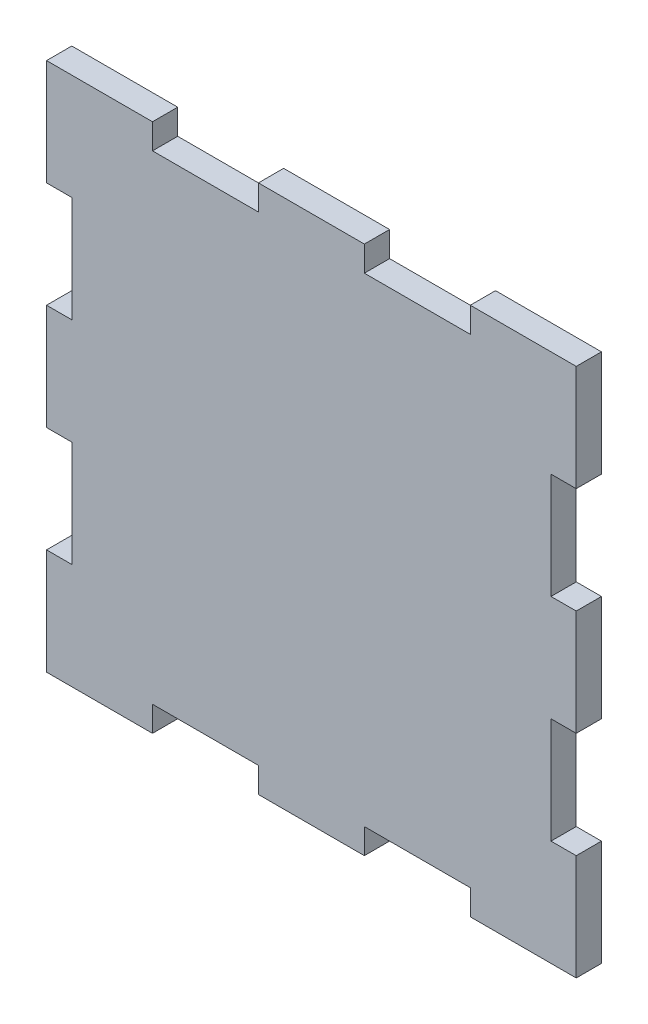
ISO-10303-21;
HEADER;
FILE_DESCRIPTION(('STEP AP214'),'2;1');
FILE_NAME('part.step','',(''),(''),'','','');
FILE_SCHEMA(('AUTOMOTIVE_DESIGN { 1 0 10303 214 1 1 1 1 }'));
ENDSEC;
DATA;
#1=APPLICATION_CONTEXT('core data for automotive mechanical design processes');
#2=APPLICATION_PROTOCOL_DEFINITION('international standard','automotive_design',2000,#1);
#3=PRODUCT_CONTEXT('',#1,'mechanical');
#4=PRODUCT('Part','Part','',(#3));
#5=PRODUCT_RELATED_PRODUCT_CATEGORY('part','',(#4));
#6=PRODUCT_DEFINITION_FORMATION('','',#4);
#7=PRODUCT_DEFINITION_CONTEXT('part definition',#1,'design');
#8=PRODUCT_DEFINITION('design','',#6,#7);
#9=PRODUCT_DEFINITION_SHAPE('','',#8);
#10=(LENGTH_UNIT() NAMED_UNIT(*) SI_UNIT(.MILLI.,.METRE.));
#11=(NAMED_UNIT(*) PLANE_ANGLE_UNIT() SI_UNIT($,.RADIAN.));
#12=(NAMED_UNIT(*) SI_UNIT($,.STERADIAN.) SOLID_ANGLE_UNIT());
#13=UNCERTAINTY_MEASURE_WITH_UNIT(LENGTH_MEASURE(1.E-05),#10,'distance_accuracy_value','');
#14=(GEOMETRIC_REPRESENTATION_CONTEXT(3) GLOBAL_UNCERTAINTY_ASSIGNED_CONTEXT((#13)) GLOBAL_UNIT_ASSIGNED_CONTEXT((#10,
#11,#12)) REPRESENTATION_CONTEXT('',''));
#15=CARTESIAN_POINT('',(0.,0.,0.));
#16=DIRECTION('',(0.,0.,1.));
#17=DIRECTION('',(1.,0.,0.));
#18=AXIS2_PLACEMENT_3D('',#15,#16,#17);
#19=CARTESIAN_POINT('',(50.,100.,4.7625));
#20=DIRECTION('',(0.,-1.,0.));
#21=DIRECTION('',(1.,0.,0.));
#22=AXIS2_PLACEMENT_3D('',#19,#20,#21);
#23=PLANE('',#22);
#24=DIRECTION('',(-1.,0.,0.));
#25=VECTOR('',#24,1.);
#26=CARTESIAN_POINT('',(50.,100.,0.));
#27=LINE('',#26,#25);
#28=CARTESIAN_POINT('',(50.,100.,0.));
#29=VERTEX_POINT('',#28);
#30=CARTESIAN_POINT('',(30.,100.,0.));
#31=VERTEX_POINT('',#30);
#32=EDGE_CURVE('E368',#29,#31,#27,.T.);
#33=ORIENTED_EDGE('',*,*,#32,.T.);
#34=DIRECTION('',(0.,0.,-1.));
#35=VECTOR('',#34,1.);
#36=CARTESIAN_POINT('',(30.,100.,-90.475));
#37=LINE('',#36,#35);
#38=CARTESIAN_POINT('',(30.,100.,4.7625));
#39=VERTEX_POINT('',#38);
#40=EDGE_CURVE('E279',#39,#31,#37,.T.);
#41=ORIENTED_EDGE('',*,*,#40,.F.);
#42=DIRECTION('',(-1.,0.,0.));
#43=VECTOR('',#42,1.);
#44=CARTESIAN_POINT('',(50.,100.,4.7625));
#45=LINE('',#44,#43);
#46=CARTESIAN_POINT('',(50.,100.,4.7625));
#47=VERTEX_POINT('',#46);
#48=EDGE_CURVE('E307',#47,#39,#45,.T.);
#49=ORIENTED_EDGE('',*,*,#48,.F.);
#50=DIRECTION('',(0.,0.,-1.));
#51=VECTOR('',#50,1.);
#52=CARTESIAN_POINT('',(50.,100.,4.7625));
#53=LINE('',#52,#51);
#54=EDGE_CURVE('E478',#47,#29,#53,.T.);
#55=ORIENTED_EDGE('',*,*,#54,.T.);
#56=EDGE_LOOP('',(#33,#41,#49,#55));
#57=FACE_BOUND('',#56,.T.);
#58=ADVANCED_FACE('F33',(#57),#23,.F.);
#59=CARTESIAN_POINT('',(10.,100.,4.7625));
#60=VERTEX_POINT('',#59);
#61=CARTESIAN_POINT('',(-9.99999999999998,100.,4.7625));
#62=VERTEX_POINT('',#61);
#63=EDGE_CURVE('E311',#60,#62,#45,.T.);
#64=ORIENTED_EDGE('',*,*,#63,.F.);
#65=DIRECTION('',(0.,0.,1.));
#66=VECTOR('',#65,1.);
#67=CARTESIAN_POINT('',(10.,100.,-90.475));
#68=LINE('',#67,#66);
#69=CARTESIAN_POINT('',(10.,100.,0.));
#70=VERTEX_POINT('',#69);
#71=EDGE_CURVE('E634',#70,#60,#68,.T.);
#72=ORIENTED_EDGE('',*,*,#71,.F.);
#73=CARTESIAN_POINT('',(-9.99999999999998,100.,0.));
#74=VERTEX_POINT('',#73);
#75=EDGE_CURVE('E372',#70,#74,#27,.T.);
#76=ORIENTED_EDGE('',*,*,#75,.T.);
#77=DIRECTION('',(0.,0.,-1.));
#78=VECTOR('',#77,1.);
#79=CARTESIAN_POINT('',(-9.99999999999998,100.,-90.475));
#80=LINE('',#79,#78);
#81=EDGE_CURVE('E632',#62,#74,#80,.T.);
#82=ORIENTED_EDGE('',*,*,#81,.F.);
#83=EDGE_LOOP('',(#64,#72,#76,#82));
#84=FACE_BOUND('',#83,.T.);
#85=ADVANCED_FACE('F631',(#84),#23,.F.);
#86=CARTESIAN_POINT('',(45.2375,40.,4.7625));
#87=DIRECTION('',(0.,1.,0.));
#88=DIRECTION('',(0.,0.,1.));
#89=AXIS2_PLACEMENT_3D('',#86,#87,#88);
#90=PLANE('',#89);
#91=DIRECTION('',(1.,0.,0.));
#92=VECTOR('',#91,1.);
#93=CARTESIAN_POINT('',(45.2375,40.,0.));
#94=LINE('',#93,#92);
#95=CARTESIAN_POINT('',(45.2375,40.,0.));
#96=VERTEX_POINT('',#95);
#97=CARTESIAN_POINT('',(50.,40.,0.));
#98=VERTEX_POINT('',#97);
#99=EDGE_CURVE('E354',#96,#98,#94,.T.);
#100=ORIENTED_EDGE('',*,*,#99,.T.);
#101=DIRECTION('',(0.,0.,-1.));
#102=VECTOR('',#101,1.);
#103=CARTESIAN_POINT('',(50.,40.,4.7625));
#104=LINE('',#103,#102);
#105=CARTESIAN_POINT('',(50.,40.,4.7625));
#106=VERTEX_POINT('',#105);
#107=EDGE_CURVE('E271',#106,#98,#104,.T.);
#108=ORIENTED_EDGE('',*,*,#107,.F.);
#109=DIRECTION('',(1.,0.,0.));
#110=VECTOR('',#109,1.);
#111=CARTESIAN_POINT('',(45.2375,40.,4.7625));
#112=LINE('',#111,#110);
#113=CARTESIAN_POINT('',(45.2375,40.,4.7625));
#114=VERTEX_POINT('',#113);
#115=EDGE_CURVE('E292',#114,#106,#112,.T.);
#116=ORIENTED_EDGE('',*,*,#115,.F.);
#117=DIRECTION('',(0.,0.,-1.));
#118=VECTOR('',#117,1.);
#119=CARTESIAN_POINT('',(45.2375,40.,4.7625));
#120=LINE('',#119,#118);
#121=EDGE_CURVE('E353',#114,#96,#120,.T.);
#122=ORIENTED_EDGE('',*,*,#121,.T.);
#123=EDGE_LOOP('',(#100,#108,#116,#122));
#124=FACE_BOUND('',#123,.T.);
#125=ADVANCED_FACE('F35',(#124),#90,.F.);
#126=CARTESIAN_POINT('',(50.,40.,4.7625));
#127=DIRECTION('',(-1.,0.,0.));
#128=DIRECTION('',(0.,-1.,0.));
#129=AXIS2_PLACEMENT_3D('',#126,#127,#128);
#130=PLANE('',#129);
#131=DIRECTION('',(0.,1.,0.));
#132=VECTOR('',#131,1.);
#133=CARTESIAN_POINT('',(50.,40.,0.));
#134=LINE('',#133,#132);
#135=CARTESIAN_POINT('',(50.0000000000002,60.,0.));
#136=VERTEX_POINT('',#135);
#137=EDGE_CURVE('E357',#98,#136,#134,.T.);
#138=ORIENTED_EDGE('',*,*,#137,.T.);
#139=DIRECTION('',(0.,0.,-1.));
#140=VECTOR('',#139,1.);
#141=CARTESIAN_POINT('',(50.0000000000002,60.,4.7625));
#142=LINE('',#141,#140);
#143=CARTESIAN_POINT('',(50.0000000000002,60.,4.7625));
#144=VERTEX_POINT('',#143);
#145=EDGE_CURVE('E490',#144,#136,#142,.T.);
#146=ORIENTED_EDGE('',*,*,#145,.F.);
#147=DIRECTION('',(0.,1.,0.));
#148=VECTOR('',#147,1.);
#149=CARTESIAN_POINT('',(50.,40.,4.7625));
#150=LINE('',#149,#148);
#151=EDGE_CURVE('E295',#106,#144,#150,.T.);
#152=ORIENTED_EDGE('',*,*,#151,.F.);
#153=ORIENTED_EDGE('',*,*,#107,.T.);
#154=EDGE_LOOP('',(#138,#146,#152,#153));
#155=FACE_BOUND('',#154,.T.);
#156=ADVANCED_FACE('F495',(#155),#130,.F.);
#157=CARTESIAN_POINT('',(50.0000000000002,60.,4.7625));
#158=DIRECTION('',(0.,-1.,0.));
#159=DIRECTION('',(0.,0.,-1.));
#160=AXIS2_PLACEMENT_3D('',#157,#158,#159);
#161=PLANE('',#160);
#162=DIRECTION('',(-1.,0.,0.));
#163=VECTOR('',#162,1.);
#164=CARTESIAN_POINT('',(50.0000000000002,60.,0.));
#165=LINE('',#164,#163);
#166=CARTESIAN_POINT('',(45.2375000000002,60.,0.));
#167=VERTEX_POINT('',#166);
#168=EDGE_CURVE('E360',#136,#167,#165,.T.);
#169=ORIENTED_EDGE('',*,*,#168,.T.);
#170=DIRECTION('',(0.,0.,-1.));
#171=VECTOR('',#170,1.);
#172=CARTESIAN_POINT('',(45.2375000000002,60.,4.7625));
#173=LINE('',#172,#171);
#174=CARTESIAN_POINT('',(45.2375000000002,60.,4.7625));
#175=VERTEX_POINT('',#174);
#176=EDGE_CURVE('E487',#175,#167,#173,.T.);
#177=ORIENTED_EDGE('',*,*,#176,.F.);
#178=DIRECTION('',(-1.,0.,0.));
#179=VECTOR('',#178,1.);
#180=CARTESIAN_POINT('',(50.0000000000002,60.,4.7625));
#181=LINE('',#180,#179);
#182=EDGE_CURVE('E298',#144,#175,#181,.T.);
#183=ORIENTED_EDGE('',*,*,#182,.F.);
#184=ORIENTED_EDGE('',*,*,#145,.T.);
#185=EDGE_LOOP('',(#169,#177,#183,#184));
#186=FACE_BOUND('',#185,.T.);
#187=ADVANCED_FACE('F508',(#186),#161,.F.);
#188=CARTESIAN_POINT('',(45.2375000000002,60.,4.7625));
#189=DIRECTION('',(-1.,0.,0.));
#190=DIRECTION('',(0.,0.,1.));
#191=AXIS2_PLACEMENT_3D('',#188,#189,#190);
#192=PLANE('',#191);
#193=DIRECTION('',(0.,1.,0.));
#194=VECTOR('',#193,1.);
#195=CARTESIAN_POINT('',(45.2375000000002,60.,0.));
#196=LINE('',#195,#194);
#197=CARTESIAN_POINT('',(45.2375000000002,80.,0.));
#198=VERTEX_POINT('',#197);
#199=EDGE_CURVE('E362',#167,#198,#196,.T.);
#200=ORIENTED_EDGE('',*,*,#199,.T.);
#201=DIRECTION('',(0.,0.,-1.));
#202=VECTOR('',#201,1.);
#203=CARTESIAN_POINT('',(45.2375000000002,80.,4.7625));
#204=LINE('',#203,#202);
#205=CARTESIAN_POINT('',(45.2375000000002,80.,4.7625));
#206=VERTEX_POINT('',#205);
#207=EDGE_CURVE('E484',#206,#198,#204,.T.);
#208=ORIENTED_EDGE('',*,*,#207,.F.);
#209=DIRECTION('',(0.,1.,0.));
#210=VECTOR('',#209,1.);
#211=CARTESIAN_POINT('',(45.2375000000002,60.,4.7625));
#212=LINE('',#211,#210);
#213=EDGE_CURVE('E300',#175,#206,#212,.T.);
#214=ORIENTED_EDGE('',*,*,#213,.F.);
#215=ORIENTED_EDGE('',*,*,#176,.T.);
#216=EDGE_LOOP('',(#200,#208,#214,#215));
#217=FACE_BOUND('',#216,.T.);
#218=ADVANCED_FACE('F512',(#217),#192,.F.);
#219=CARTESIAN_POINT('',(45.2375000000002,80.,4.7625));
#220=DIRECTION('',(0.,1.,0.));
#221=DIRECTION('',(0.,0.,1.));
#222=AXIS2_PLACEMENT_3D('',#219,#220,#221);
#223=PLANE('',#222);
#224=DIRECTION('',(1.,0.,0.));
#225=VECTOR('',#224,1.);
#226=CARTESIAN_POINT('',(45.2375000000002,80.,0.));
#227=LINE('',#226,#225);
#228=CARTESIAN_POINT('',(50.0000000000002,80.,0.));
#229=VERTEX_POINT('',#228);
#230=EDGE_CURVE('E364',#198,#229,#227,.T.);
#231=ORIENTED_EDGE('',*,*,#230,.T.);
#232=DIRECTION('',(0.,0.,-1.));
#233=VECTOR('',#232,1.);
#234=CARTESIAN_POINT('',(50.0000000000002,80.,4.7625));
#235=LINE('',#234,#233);
#236=CARTESIAN_POINT('',(50.0000000000002,80.,4.7625));
#237=VERTEX_POINT('',#236);
#238=EDGE_CURVE('E481',#237,#229,#235,.T.);
#239=ORIENTED_EDGE('',*,*,#238,.F.);
#240=DIRECTION('',(1.,0.,0.));
#241=VECTOR('',#240,1.);
#242=CARTESIAN_POINT('',(45.2375000000002,80.,4.7625));
#243=LINE('',#242,#241);
#244=EDGE_CURVE('E302',#206,#237,#243,.T.);
#245=ORIENTED_EDGE('',*,*,#244,.F.);
#246=ORIENTED_EDGE('',*,*,#207,.T.);
#247=EDGE_LOOP('',(#231,#239,#245,#246));
#248=FACE_BOUND('',#247,.T.);
#249=ADVANCED_FACE('F687',(#248),#223,.F.);
#250=CARTESIAN_POINT('',(50.0000000000002,80.,4.7625));
#251=DIRECTION('',(-1.,0.,0.));
#252=DIRECTION('',(0.,-1.,0.));
#253=AXIS2_PLACEMENT_3D('',#250,#251,#252);
#254=PLANE('',#253);
#255=DIRECTION('',(0.,1.,0.));
#256=VECTOR('',#255,1.);
#257=CARTESIAN_POINT('',(50.0000000000002,80.,0.));
#258=LINE('',#257,#256);
#259=EDGE_CURVE('E366',#229,#29,#258,.T.);
#260=ORIENTED_EDGE('',*,*,#259,.T.);
#261=ORIENTED_EDGE('',*,*,#54,.F.);
#262=DIRECTION('',(0.,1.,0.));
#263=VECTOR('',#262,1.);
#264=CARTESIAN_POINT('',(50.0000000000002,80.,4.7625));
#265=LINE('',#264,#263);
#266=EDGE_CURVE('E304',#237,#47,#265,.T.);
#267=ORIENTED_EDGE('',*,*,#266,.F.);
#268=ORIENTED_EDGE('',*,*,#238,.T.);
#269=EDGE_LOOP('',(#260,#261,#267,#268));
#270=FACE_BOUND('',#269,.T.);
#271=ADVANCED_FACE('F682',(#270),#254,.F.);
#272=CARTESIAN_POINT('',(-30.,100.,4.7625));
#273=VERTEX_POINT('',#272);
#274=CARTESIAN_POINT('',(-50.,100.,4.7625));
#275=VERTEX_POINT('',#274);
#276=EDGE_CURVE('E306',#273,#275,#45,.T.);
#277=ORIENTED_EDGE('',*,*,#276,.F.);
#278=DIRECTION('',(0.,0.,1.));
#279=VECTOR('',#278,1.);
#280=CARTESIAN_POINT('',(-30.,100.,-90.475));
#281=LINE('',#280,#279);
#282=CARTESIAN_POINT('',(-30.,100.,0.));
#283=VERTEX_POINT('',#282);
#284=EDGE_CURVE('E624',#283,#273,#281,.T.);
#285=ORIENTED_EDGE('',*,*,#284,.F.);
#286=CARTESIAN_POINT('',(-50.,100.,0.));
#287=VERTEX_POINT('',#286);
#288=EDGE_CURVE('E284',#283,#287,#27,.T.);
#289=ORIENTED_EDGE('',*,*,#288,.T.);
#290=DIRECTION('',(0.,0.,-1.));
#291=VECTOR('',#290,1.);
#292=CARTESIAN_POINT('',(-50.,100.,4.7625));
#293=LINE('',#292,#291);
#294=EDGE_CURVE('E475',#275,#287,#293,.T.);
#295=ORIENTED_EDGE('',*,*,#294,.F.);
#296=EDGE_LOOP('',(#277,#285,#289,#295));
#297=FACE_BOUND('',#296,.T.);
#298=ADVANCED_FACE('F623',(#297),#23,.F.);
#299=CARTESIAN_POINT('',(-50.,100.,4.7625));
#300=DIRECTION('',(1.,0.,0.));
#301=DIRECTION('',(0.,1.,0.));
#302=AXIS2_PLACEMENT_3D('',#299,#300,#301);
#303=PLANE('',#302);
#304=DIRECTION('',(0.,-1.,0.));
#305=VECTOR('',#304,1.);
#306=CARTESIAN_POINT('',(-50.,100.,0.));
#307=LINE('',#306,#305);
#308=CARTESIAN_POINT('',(-49.9999999999998,80.,0.));
#309=VERTEX_POINT('',#308);
#310=EDGE_CURVE('E371',#287,#309,#307,.T.);
#311=ORIENTED_EDGE('',*,*,#310,.T.);
#312=DIRECTION('',(0.,0.,-1.));
#313=VECTOR('',#312,1.);
#314=CARTESIAN_POINT('',(-49.9999999999998,80.,4.7625));
#315=LINE('',#314,#313);
#316=CARTESIAN_POINT('',(-49.9999999999998,80.,4.7625));
#317=VERTEX_POINT('',#316);
#318=EDGE_CURVE('E472',#317,#309,#315,.T.);
#319=ORIENTED_EDGE('',*,*,#318,.F.);
#320=DIRECTION('',(0.,-1.,0.));
#321=VECTOR('',#320,1.);
#322=CARTESIAN_POINT('',(-50.,100.,4.7625));
#323=LINE('',#322,#321);
#324=EDGE_CURVE('E310',#275,#317,#323,.T.);
#325=ORIENTED_EDGE('',*,*,#324,.F.);
#326=ORIENTED_EDGE('',*,*,#294,.T.);
#327=EDGE_LOOP('',(#311,#319,#325,#326));
#328=FACE_BOUND('',#327,.T.);
#329=ADVANCED_FACE('F618',(#328),#303,.F.);
#330=CARTESIAN_POINT('',(-49.9999999999998,80.,4.7625));
#331=DIRECTION('',(0.,1.,0.));
#332=DIRECTION('',(0.,0.,1.));
#333=AXIS2_PLACEMENT_3D('',#330,#331,#332);
#334=PLANE('',#333);
#335=DIRECTION('',(1.,0.,0.));
#336=VECTOR('',#335,1.);
#337=CARTESIAN_POINT('',(-49.9999999999998,80.,0.));
#338=LINE('',#337,#336);
#339=CARTESIAN_POINT('',(-45.2374999999998,80.,0.));
#340=VERTEX_POINT('',#339);
#341=EDGE_CURVE('E374',#309,#340,#338,.T.);
#342=ORIENTED_EDGE('',*,*,#341,.T.);
#343=DIRECTION('',(0.,0.,-1.));
#344=VECTOR('',#343,1.);
#345=CARTESIAN_POINT('',(-45.2374999999998,80.,4.7625));
#346=LINE('',#345,#344);
#347=CARTESIAN_POINT('',(-45.2374999999998,80.,4.7625));
#348=VERTEX_POINT('',#347);
#349=EDGE_CURVE('E469',#348,#340,#346,.T.);
#350=ORIENTED_EDGE('',*,*,#349,.F.);
#351=DIRECTION('',(1.,0.,0.));
#352=VECTOR('',#351,1.);
#353=CARTESIAN_POINT('',(-49.9999999999998,80.,4.7625));
#354=LINE('',#353,#352);
#355=EDGE_CURVE('E313',#317,#348,#354,.T.);
#356=ORIENTED_EDGE('',*,*,#355,.F.);
#357=ORIENTED_EDGE('',*,*,#318,.T.);
#358=EDGE_LOOP('',(#342,#350,#356,#357));
#359=FACE_BOUND('',#358,.T.);
#360=ADVANCED_FACE('F615',(#359),#334,.F.);
#361=CARTESIAN_POINT('',(-45.2374999999998,80.,4.7625));
#362=DIRECTION('',(1.,0.,0.));
#363=DIRECTION('',(0.,0.,-1.));
#364=AXIS2_PLACEMENT_3D('',#361,#362,#363);
#365=PLANE('',#364);
#366=DIRECTION('',(0.,-1.,0.));
#367=VECTOR('',#366,1.);
#368=CARTESIAN_POINT('',(-45.2374999999998,80.,0.));
#369=LINE('',#368,#367);
#370=CARTESIAN_POINT('',(-45.2374999999998,60.,0.));
#371=VERTEX_POINT('',#370);
#372=EDGE_CURVE('E376',#340,#371,#369,.T.);
#373=ORIENTED_EDGE('',*,*,#372,.T.);
#374=DIRECTION('',(0.,0.,-1.));
#375=VECTOR('',#374,1.);
#376=CARTESIAN_POINT('',(-45.2374999999998,60.,4.7625));
#377=LINE('',#376,#375);
#378=CARTESIAN_POINT('',(-45.2374999999998,60.,4.7625));
#379=VERTEX_POINT('',#378);
#380=EDGE_CURVE('E466',#379,#371,#377,.T.);
#381=ORIENTED_EDGE('',*,*,#380,.F.);
#382=DIRECTION('',(0.,-1.,0.));
#383=VECTOR('',#382,1.);
#384=CARTESIAN_POINT('',(-45.2374999999998,80.,4.7625));
#385=LINE('',#384,#383);
#386=EDGE_CURVE('E315',#348,#379,#385,.T.);
#387=ORIENTED_EDGE('',*,*,#386,.F.);
#388=ORIENTED_EDGE('',*,*,#349,.T.);
#389=EDGE_LOOP('',(#373,#381,#387,#388));
#390=FACE_BOUND('',#389,.T.);
#391=ADVANCED_FACE('F611',(#390),#365,.F.);
#392=CARTESIAN_POINT('',(-45.2374999999998,60.,4.7625));
#393=DIRECTION('',(0.,-1.,0.));
#394=DIRECTION('',(0.,0.,-1.));
#395=AXIS2_PLACEMENT_3D('',#392,#393,#394);
#396=PLANE('',#395);
#397=DIRECTION('',(-1.,0.,0.));
#398=VECTOR('',#397,1.);
#399=CARTESIAN_POINT('',(-45.2374999999998,60.,0.));
#400=LINE('',#399,#398);
#401=CARTESIAN_POINT('',(-49.9999999999998,60.,0.));
#402=VERTEX_POINT('',#401);
#403=EDGE_CURVE('E378',#371,#402,#400,.T.);
#404=ORIENTED_EDGE('',*,*,#403,.T.);
#405=DIRECTION('',(0.,0.,-1.));
#406=VECTOR('',#405,1.);
#407=CARTESIAN_POINT('',(-49.9999999999998,60.,4.7625));
#408=LINE('',#407,#406);
#409=CARTESIAN_POINT('',(-49.9999999999998,60.,4.7625));
#410=VERTEX_POINT('',#409);
#411=EDGE_CURVE('E463',#410,#402,#408,.T.);
#412=ORIENTED_EDGE('',*,*,#411,.F.);
#413=DIRECTION('',(-1.,0.,0.));
#414=VECTOR('',#413,1.);
#415=CARTESIAN_POINT('',(-45.2374999999998,60.,4.7625));
#416=LINE('',#415,#414);
#417=EDGE_CURVE('E317',#379,#410,#416,.T.);
#418=ORIENTED_EDGE('',*,*,#417,.F.);
#419=ORIENTED_EDGE('',*,*,#380,.T.);
#420=EDGE_LOOP('',(#404,#412,#418,#419));
#421=FACE_BOUND('',#420,.T.);
#422=ADVANCED_FACE('F606',(#421),#396,.F.);
#423=CARTESIAN_POINT('',(-49.9999999999998,60.,4.7625));
#424=DIRECTION('',(1.,0.,0.));
#425=DIRECTION('',(0.,1.,0.));
#426=AXIS2_PLACEMENT_3D('',#423,#424,#425);
#427=PLANE('',#426);
#428=DIRECTION('',(0.,-1.,0.));
#429=VECTOR('',#428,1.);
#430=CARTESIAN_POINT('',(-49.9999999999998,60.,0.));
#431=LINE('',#430,#429);
#432=CARTESIAN_POINT('',(-49.9999999999999,40.,0.));
#433=VERTEX_POINT('',#432);
#434=EDGE_CURVE('E380',#402,#433,#431,.T.);
#435=ORIENTED_EDGE('',*,*,#434,.T.);
#436=DIRECTION('',(0.,0.,-1.));
#437=VECTOR('',#436,1.);
#438=CARTESIAN_POINT('',(-49.9999999999999,40.,4.7625));
#439=LINE('',#438,#437);
#440=CARTESIAN_POINT('',(-49.9999999999999,40.,4.7625));
#441=VERTEX_POINT('',#440);
#442=EDGE_CURVE('E460',#441,#433,#439,.T.);
#443=ORIENTED_EDGE('',*,*,#442,.F.);
#444=DIRECTION('',(0.,-1.,0.));
#445=VECTOR('',#444,1.);
#446=CARTESIAN_POINT('',(-49.9999999999998,60.,4.7625));
#447=LINE('',#446,#445);
#448=EDGE_CURVE('E319',#410,#441,#447,.T.);
#449=ORIENTED_EDGE('',*,*,#448,.F.);
#450=ORIENTED_EDGE('',*,*,#411,.T.);
#451=EDGE_LOOP('',(#435,#443,#449,#450));
#452=FACE_BOUND('',#451,.T.);
#453=ADVANCED_FACE('F600',(#452),#427,.F.);
#454=CARTESIAN_POINT('',(-49.9999999999999,40.,4.7625));
#455=DIRECTION('',(0.,1.,0.));
#456=DIRECTION('',(0.,0.,1.));
#457=AXIS2_PLACEMENT_3D('',#454,#455,#456);
#458=PLANE('',#457);
#459=DIRECTION('',(1.,0.,0.));
#460=VECTOR('',#459,1.);
#461=CARTESIAN_POINT('',(-49.9999999999999,40.,0.));
#462=LINE('',#461,#460);
#463=CARTESIAN_POINT('',(-45.2374999999999,40.,0.));
#464=VERTEX_POINT('',#463);
#465=EDGE_CURVE('E382',#433,#464,#462,.T.);
#466=ORIENTED_EDGE('',*,*,#465,.T.);
#467=DIRECTION('',(0.,0.,-1.));
#468=VECTOR('',#467,1.);
#469=CARTESIAN_POINT('',(-45.2374999999999,40.,4.7625));
#470=LINE('',#469,#468);
#471=CARTESIAN_POINT('',(-45.2374999999999,40.,4.7625));
#472=VERTEX_POINT('',#471);
#473=EDGE_CURVE('E457',#472,#464,#470,.T.);
#474=ORIENTED_EDGE('',*,*,#473,.F.);
#475=DIRECTION('',(1.,0.,0.));
#476=VECTOR('',#475,1.);
#477=CARTESIAN_POINT('',(-49.9999999999999,40.,4.7625));
#478=LINE('',#477,#476);
#479=EDGE_CURVE('E321',#441,#472,#478,.T.);
#480=ORIENTED_EDGE('',*,*,#479,.F.);
#481=ORIENTED_EDGE('',*,*,#442,.T.);
#482=EDGE_LOOP('',(#466,#474,#480,#481));
#483=FACE_BOUND('',#482,.T.);
#484=ADVANCED_FACE('F596',(#483),#458,.F.);
#485=CARTESIAN_POINT('',(-45.2374999999999,40.,4.7625));
#486=DIRECTION('',(1.,0.,0.));
#487=DIRECTION('',(0.,0.,-1.));
#488=AXIS2_PLACEMENT_3D('',#485,#486,#487);
#489=PLANE('',#488);
#490=DIRECTION('',(0.,-1.,0.));
#491=VECTOR('',#490,1.);
#492=CARTESIAN_POINT('',(-45.2374999999999,40.,0.));
#493=LINE('',#492,#491);
#494=CARTESIAN_POINT('',(-45.2374999999999,20.,0.));
#495=VERTEX_POINT('',#494);
#496=EDGE_CURVE('E384',#464,#495,#493,.T.);
#497=ORIENTED_EDGE('',*,*,#496,.T.);
#498=DIRECTION('',(0.,0.,-1.));
#499=VECTOR('',#498,1.);
#500=CARTESIAN_POINT('',(-45.2374999999999,20.,4.7625));
#501=LINE('',#500,#499);
#502=CARTESIAN_POINT('',(-45.2374999999999,20.,4.7625));
#503=VERTEX_POINT('',#502);
#504=EDGE_CURVE('E454',#503,#495,#501,.T.);
#505=ORIENTED_EDGE('',*,*,#504,.F.);
#506=DIRECTION('',(0.,-1.,0.));
#507=VECTOR('',#506,1.);
#508=CARTESIAN_POINT('',(-45.2374999999999,40.,4.7625));
#509=LINE('',#508,#507);
#510=EDGE_CURVE('E323',#472,#503,#509,.T.);
#511=ORIENTED_EDGE('',*,*,#510,.F.);
#512=ORIENTED_EDGE('',*,*,#473,.T.);
#513=EDGE_LOOP('',(#497,#505,#511,#512));
#514=FACE_BOUND('',#513,.T.);
#515=ADVANCED_FACE('F591',(#514),#489,.F.);
#516=CARTESIAN_POINT('',(-45.2374999999999,20.,4.7625));
#517=DIRECTION('',(0.,-1.,0.));
#518=DIRECTION('',(0.,0.,-1.));
#519=AXIS2_PLACEMENT_3D('',#516,#517,#518);
#520=PLANE('',#519);
#521=DIRECTION('',(-1.,0.,0.));
#522=VECTOR('',#521,1.);
#523=CARTESIAN_POINT('',(-45.2374999999999,20.,0.));
#524=LINE('',#523,#522);
#525=CARTESIAN_POINT('',(-49.9999999999999,20.,0.));
#526=VERTEX_POINT('',#525);
#527=EDGE_CURVE('E386',#495,#526,#524,.T.);
#528=ORIENTED_EDGE('',*,*,#527,.T.);
#529=DIRECTION('',(0.,0.,-1.));
#530=VECTOR('',#529,1.);
#531=CARTESIAN_POINT('',(-49.9999999999999,20.,4.7625));
#532=LINE('',#531,#530);
#533=CARTESIAN_POINT('',(-49.9999999999999,20.,4.7625));
#534=VERTEX_POINT('',#533);
#535=EDGE_CURVE('E451',#534,#526,#532,.T.);
#536=ORIENTED_EDGE('',*,*,#535,.F.);
#537=DIRECTION('',(-1.,0.,0.));
#538=VECTOR('',#537,1.);
#539=CARTESIAN_POINT('',(-45.2374999999999,20.,4.7625));
#540=LINE('',#539,#538);
#541=EDGE_CURVE('E325',#503,#534,#540,.T.);
#542=ORIENTED_EDGE('',*,*,#541,.F.);
#543=ORIENTED_EDGE('',*,*,#504,.T.);
#544=EDGE_LOOP('',(#528,#536,#542,#543));
#545=FACE_BOUND('',#544,.T.);
#546=ADVANCED_FACE('F585',(#545),#520,.F.);
#547=CARTESIAN_POINT('',(-49.9999999999999,20.,4.7625));
#548=DIRECTION('',(1.,0.,0.));
#549=DIRECTION('',(0.,1.,0.));
#550=AXIS2_PLACEMENT_3D('',#547,#548,#549);
#551=PLANE('',#550);
#552=DIRECTION('',(0.,-1.,0.));
#553=VECTOR('',#552,1.);
#554=CARTESIAN_POINT('',(-49.9999999999999,20.,0.));
#555=LINE('',#554,#553);
#556=CARTESIAN_POINT('',(-50.,0.,0.));
#557=VERTEX_POINT('',#556);
#558=EDGE_CURVE('E388',#526,#557,#555,.T.);
#559=ORIENTED_EDGE('',*,*,#558,.T.);
#560=DIRECTION('',(0.,0.,-1.));
#561=VECTOR('',#560,1.);
#562=CARTESIAN_POINT('',(-50.,0.,4.7625));
#563=LINE('',#562,#561);
#564=CARTESIAN_POINT('',(-50.,0.,4.7625));
#565=VERTEX_POINT('',#564);
#566=EDGE_CURVE('E448',#565,#557,#563,.T.);
#567=ORIENTED_EDGE('',*,*,#566,.F.);
#568=DIRECTION('',(0.,-1.,0.));
#569=VECTOR('',#568,1.);
#570=CARTESIAN_POINT('',(-49.9999999999999,20.,4.7625));
#571=LINE('',#570,#569);
#572=EDGE_CURVE('E327',#534,#565,#571,.T.);
#573=ORIENTED_EDGE('',*,*,#572,.F.);
#574=ORIENTED_EDGE('',*,*,#535,.T.);
#575=EDGE_LOOP('',(#559,#567,#573,#574));
#576=FACE_BOUND('',#575,.T.);
#577=ADVANCED_FACE('F581',(#576),#551,.F.);
#578=CARTESIAN_POINT('',(-50.,0.,4.7625));
#579=DIRECTION('',(0.,1.,0.));
#580=DIRECTION('',(0.,0.,1.));
#581=AXIS2_PLACEMENT_3D('',#578,#579,#580);
#582=PLANE('',#581);
#583=DIRECTION('',(1.,0.,0.));
#584=VECTOR('',#583,1.);
#585=CARTESIAN_POINT('',(-50.,0.,0.));
#586=LINE('',#585,#584);
#587=CARTESIAN_POINT('',(-30.,0.,0.));
#588=VERTEX_POINT('',#587);
#589=EDGE_CURVE('E390',#557,#588,#586,.T.);
#590=ORIENTED_EDGE('',*,*,#589,.T.);
#591=DIRECTION('',(0.,0.,-1.));
#592=VECTOR('',#591,1.);
#593=CARTESIAN_POINT('',(-30.,0.,4.7625));
#594=LINE('',#593,#592);
#595=CARTESIAN_POINT('',(-30.,0.,4.7625));
#596=VERTEX_POINT('',#595);
#597=EDGE_CURVE('E445',#596,#588,#594,.T.);
#598=ORIENTED_EDGE('',*,*,#597,.F.);
#599=DIRECTION('',(1.,0.,0.));
#600=VECTOR('',#599,1.);
#601=CARTESIAN_POINT('',(-50.,0.,4.7625));
#602=LINE('',#601,#600);
#603=EDGE_CURVE('E329',#565,#596,#602,.T.);
#604=ORIENTED_EDGE('',*,*,#603,.F.);
#605=ORIENTED_EDGE('',*,*,#566,.T.);
#606=EDGE_LOOP('',(#590,#598,#604,#605));
#607=FACE_BOUND('',#606,.T.);
#608=ADVANCED_FACE('F576',(#607),#582,.F.);
#609=CARTESIAN_POINT('',(-30.,0.,4.7625));
#610=DIRECTION('',(-1.,0.,0.));
#611=DIRECTION('',(0.,0.,1.));
#612=AXIS2_PLACEMENT_3D('',#609,#610,#611);
#613=PLANE('',#612);
#614=DIRECTION('',(0.,1.,0.));
#615=VECTOR('',#614,1.);
#616=CARTESIAN_POINT('',(-30.,0.,0.));
#617=LINE('',#616,#615);
#618=CARTESIAN_POINT('',(-30.,4.7625,0.));
#619=VERTEX_POINT('',#618);
#620=EDGE_CURVE('E392',#588,#619,#617,.T.);
#621=ORIENTED_EDGE('',*,*,#620,.T.);
#622=DIRECTION('',(0.,0.,-1.));
#623=VECTOR('',#622,1.);
#624=CARTESIAN_POINT('',(-30.,4.7625,4.7625));
#625=LINE('',#624,#623);
#626=CARTESIAN_POINT('',(-30.,4.7625,4.7625));
#627=VERTEX_POINT('',#626);
#628=EDGE_CURVE('E442',#627,#619,#625,.T.);
#629=ORIENTED_EDGE('',*,*,#628,.F.);
#630=DIRECTION('',(0.,1.,0.));
#631=VECTOR('',#630,1.);
#632=CARTESIAN_POINT('',(-30.,0.,4.7625));
#633=LINE('',#632,#631);
#634=EDGE_CURVE('E331',#596,#627,#633,.T.);
#635=ORIENTED_EDGE('',*,*,#634,.F.);
#636=ORIENTED_EDGE('',*,*,#597,.T.);
#637=EDGE_LOOP('',(#621,#629,#635,#636));
#638=FACE_BOUND('',#637,.T.);
#639=ADVANCED_FACE('F570',(#638),#613,.F.);
#640=CARTESIAN_POINT('',(-30.,4.7625,4.7625));
#641=DIRECTION('',(0.,1.,0.));
#642=DIRECTION('',(0.,0.,1.));
#643=AXIS2_PLACEMENT_3D('',#640,#641,#642);
#644=PLANE('',#643);
#645=DIRECTION('',(1.,0.,0.));
#646=VECTOR('',#645,1.);
#647=CARTESIAN_POINT('',(-30.,4.7625,0.));
#648=LINE('',#647,#646);
#649=CARTESIAN_POINT('',(-10.,4.7625,0.));
#650=VERTEX_POINT('',#649);
#651=EDGE_CURVE('E394',#619,#650,#648,.T.);
#652=ORIENTED_EDGE('',*,*,#651,.T.);
#653=DIRECTION('',(0.,0.,-1.));
#654=VECTOR('',#653,1.);
#655=CARTESIAN_POINT('',(-10.,4.7625,4.7625));
#656=LINE('',#655,#654);
#657=CARTESIAN_POINT('',(-10.,4.7625,4.7625));
#658=VERTEX_POINT('',#657);
#659=EDGE_CURVE('E439',#658,#650,#656,.T.);
#660=ORIENTED_EDGE('',*,*,#659,.F.);
#661=DIRECTION('',(1.,0.,0.));
#662=VECTOR('',#661,1.);
#663=CARTESIAN_POINT('',(-30.,4.7625,4.7625));
#664=LINE('',#663,#662);
#665=EDGE_CURVE('E333',#627,#658,#664,.T.);
#666=ORIENTED_EDGE('',*,*,#665,.F.);
#667=ORIENTED_EDGE('',*,*,#628,.T.);
#668=EDGE_LOOP('',(#652,#660,#666,#667));
#669=FACE_BOUND('',#668,.T.);
#670=ADVANCED_FACE('F566',(#669),#644,.F.);
#671=CARTESIAN_POINT('',(-10.,4.7625,4.7625));
#672=DIRECTION('',(1.,0.,0.));
#673=DIRECTION('',(0.,1.,0.));
#674=AXIS2_PLACEMENT_3D('',#671,#672,#673);
#675=PLANE('',#674);
#676=DIRECTION('',(0.,-1.,0.));
#677=VECTOR('',#676,1.);
#678=CARTESIAN_POINT('',(-10.,4.7625,0.));
#679=LINE('',#678,#677);
#680=CARTESIAN_POINT('',(-10.,0.,0.));
#681=VERTEX_POINT('',#680);
#682=EDGE_CURVE('E396',#650,#681,#679,.T.);
#683=ORIENTED_EDGE('',*,*,#682,.T.);
#684=DIRECTION('',(0.,0.,-1.));
#685=VECTOR('',#684,1.);
#686=CARTESIAN_POINT('',(-10.,0.,4.7625));
#687=LINE('',#686,#685);
#688=CARTESIAN_POINT('',(-10.,0.,4.7625));
#689=VERTEX_POINT('',#688);
#690=EDGE_CURVE('E436',#689,#681,#687,.T.);
#691=ORIENTED_EDGE('',*,*,#690,.F.);
#692=DIRECTION('',(0.,-1.,0.));
#693=VECTOR('',#692,1.);
#694=CARTESIAN_POINT('',(-10.,4.7625,4.7625));
#695=LINE('',#694,#693);
#696=EDGE_CURVE('E335',#658,#689,#695,.T.);
#697=ORIENTED_EDGE('',*,*,#696,.F.);
#698=ORIENTED_EDGE('',*,*,#659,.T.);
#699=EDGE_LOOP('',(#683,#691,#697,#698));
#700=FACE_BOUND('',#699,.T.);
#701=ADVANCED_FACE('F561',(#700),#675,.F.);
#702=CARTESIAN_POINT('',(-10.,0.,4.7625));
#703=DIRECTION('',(0.,1.,0.));
#704=DIRECTION('',(-1.,0.,0.));
#705=AXIS2_PLACEMENT_3D('',#702,#703,#704);
#706=PLANE('',#705);
#707=DIRECTION('',(1.,0.,0.));
#708=VECTOR('',#707,1.);
#709=CARTESIAN_POINT('',(-10.,0.,0.));
#710=LINE('',#709,#708);
#711=CARTESIAN_POINT('',(9.99999999999999,0.,0.));
#712=VERTEX_POINT('',#711);
#713=EDGE_CURVE('E398',#681,#712,#710,.T.);
#714=ORIENTED_EDGE('',*,*,#713,.T.);
#715=DIRECTION('',(0.,0.,-1.));
#716=VECTOR('',#715,1.);
#717=CARTESIAN_POINT('',(9.99999999999999,0.,4.7625));
#718=LINE('',#717,#716);
#719=CARTESIAN_POINT('',(9.99999999999999,0.,4.7625));
#720=VERTEX_POINT('',#719);
#721=EDGE_CURVE('E433',#720,#712,#718,.T.);
#722=ORIENTED_EDGE('',*,*,#721,.F.);
#723=DIRECTION('',(1.,0.,0.));
#724=VECTOR('',#723,1.);
#725=CARTESIAN_POINT('',(-10.,0.,4.7625));
#726=LINE('',#725,#724);
#727=EDGE_CURVE('E337',#689,#720,#726,.T.);
#728=ORIENTED_EDGE('',*,*,#727,.F.);
#729=ORIENTED_EDGE('',*,*,#690,.T.);
#730=EDGE_LOOP('',(#714,#722,#728,#729));
#731=FACE_BOUND('',#730,.T.);
#732=ADVANCED_FACE('F555',(#731),#706,.F.);
#733=CARTESIAN_POINT('',(9.99999999999999,0.,4.7625));
#734=DIRECTION('',(-1.,0.,0.));
#735=DIRECTION('',(0.,0.,1.));
#736=AXIS2_PLACEMENT_3D('',#733,#734,#735);
#737=PLANE('',#736);
#738=DIRECTION('',(0.,1.,0.));
#739=VECTOR('',#738,1.);
#740=CARTESIAN_POINT('',(9.99999999999999,0.,0.));
#741=LINE('',#740,#739);
#742=CARTESIAN_POINT('',(9.99999999999999,4.7625,0.));
#743=VERTEX_POINT('',#742);
#744=EDGE_CURVE('E400',#712,#743,#741,.T.);
#745=ORIENTED_EDGE('',*,*,#744,.T.);
#746=DIRECTION('',(0.,0.,-1.));
#747=VECTOR('',#746,1.);
#748=CARTESIAN_POINT('',(9.99999999999999,4.7625,4.7625));
#749=LINE('',#748,#747);
#750=CARTESIAN_POINT('',(9.99999999999999,4.7625,4.7625));
#751=VERTEX_POINT('',#750);
#752=EDGE_CURVE('E430',#751,#743,#749,.T.);
#753=ORIENTED_EDGE('',*,*,#752,.F.);
#754=DIRECTION('',(0.,1.,0.));
#755=VECTOR('',#754,1.);
#756=CARTESIAN_POINT('',(9.99999999999999,0.,4.7625));
#757=LINE('',#756,#755);
#758=EDGE_CURVE('E339',#720,#751,#757,.T.);
#759=ORIENTED_EDGE('',*,*,#758,.F.);
#760=ORIENTED_EDGE('',*,*,#721,.T.);
#761=EDGE_LOOP('',(#745,#753,#759,#760));
#762=FACE_BOUND('',#761,.T.);
#763=ADVANCED_FACE('F551',(#762),#737,.F.);
#764=CARTESIAN_POINT('',(9.99999999999999,4.7625,4.7625));
#765=DIRECTION('',(0.,1.,0.));
#766=DIRECTION('',(0.,0.,1.));
#767=AXIS2_PLACEMENT_3D('',#764,#765,#766);
#768=PLANE('',#767);
#769=DIRECTION('',(1.,0.,0.));
#770=VECTOR('',#769,1.);
#771=CARTESIAN_POINT('',(9.99999999999999,4.7625,0.));
#772=LINE('',#771,#770);
#773=CARTESIAN_POINT('',(30.,4.7625,0.));
#774=VERTEX_POINT('',#773);
#775=EDGE_CURVE('E402',#743,#774,#772,.T.);
#776=ORIENTED_EDGE('',*,*,#775,.T.);
#777=DIRECTION('',(0.,0.,-1.));
#778=VECTOR('',#777,1.);
#779=CARTESIAN_POINT('',(30.,4.7625,4.7625));
#780=LINE('',#779,#778);
#781=CARTESIAN_POINT('',(30.,4.7625,4.7625));
#782=VERTEX_POINT('',#781);
#783=EDGE_CURVE('E427',#782,#774,#780,.T.);
#784=ORIENTED_EDGE('',*,*,#783,.F.);
#785=DIRECTION('',(1.,0.,0.));
#786=VECTOR('',#785,1.);
#787=CARTESIAN_POINT('',(9.99999999999999,4.7625,4.7625));
#788=LINE('',#787,#786);
#789=EDGE_CURVE('E341',#751,#782,#788,.T.);
#790=ORIENTED_EDGE('',*,*,#789,.F.);
#791=ORIENTED_EDGE('',*,*,#752,.T.);
#792=EDGE_LOOP('',(#776,#784,#790,#791));
#793=FACE_BOUND('',#792,.T.);
#794=ADVANCED_FACE('F546',(#793),#768,.F.);
#795=CARTESIAN_POINT('',(30.,4.7625,4.7625));
#796=DIRECTION('',(1.,0.,0.));
#797=DIRECTION('',(0.,1.,0.));
#798=AXIS2_PLACEMENT_3D('',#795,#796,#797);
#799=PLANE('',#798);
#800=DIRECTION('',(0.,-1.,0.));
#801=VECTOR('',#800,1.);
#802=CARTESIAN_POINT('',(30.,4.7625,0.));
#803=LINE('',#802,#801);
#804=CARTESIAN_POINT('',(30.,0.,0.));
#805=VERTEX_POINT('',#804);
#806=EDGE_CURVE('E404',#774,#805,#803,.T.);
#807=ORIENTED_EDGE('',*,*,#806,.T.);
#808=DIRECTION('',(0.,0.,-1.));
#809=VECTOR('',#808,1.);
#810=CARTESIAN_POINT('',(30.,0.,4.7625));
#811=LINE('',#810,#809);
#812=CARTESIAN_POINT('',(30.,0.,4.7625));
#813=VERTEX_POINT('',#812);
#814=EDGE_CURVE('E424',#813,#805,#811,.T.);
#815=ORIENTED_EDGE('',*,*,#814,.F.);
#816=DIRECTION('',(0.,-1.,0.));
#817=VECTOR('',#816,1.);
#818=CARTESIAN_POINT('',(30.,4.7625,4.7625));
#819=LINE('',#818,#817);
#820=EDGE_CURVE('E343',#782,#813,#819,.T.);
#821=ORIENTED_EDGE('',*,*,#820,.F.);
#822=ORIENTED_EDGE('',*,*,#783,.T.);
#823=EDGE_LOOP('',(#807,#815,#821,#822));
#824=FACE_BOUND('',#823,.T.);
#825=ADVANCED_FACE('F540',(#824),#799,.F.);
#826=CARTESIAN_POINT('',(30.,0.,4.7625));
#827=DIRECTION('',(0.,1.,0.));
#828=DIRECTION('',(-1.,0.,0.));
#829=AXIS2_PLACEMENT_3D('',#826,#827,#828);
#830=PLANE('',#829);
#831=DIRECTION('',(1.,0.,0.));
#832=VECTOR('',#831,1.);
#833=CARTESIAN_POINT('',(30.,0.,0.));
#834=LINE('',#833,#832);
#835=CARTESIAN_POINT('',(50.,0.,0.));
#836=VERTEX_POINT('',#835);
#837=EDGE_CURVE('E406',#805,#836,#834,.T.);
#838=ORIENTED_EDGE('',*,*,#837,.T.);
#839=DIRECTION('',(0.,0.,-1.));
#840=VECTOR('',#839,1.);
#841=CARTESIAN_POINT('',(50.,0.,4.7625));
#842=LINE('',#841,#840);
#843=CARTESIAN_POINT('',(50.,0.,4.7625));
#844=VERTEX_POINT('',#843);
#845=EDGE_CURVE('E421',#844,#836,#842,.T.);
#846=ORIENTED_EDGE('',*,*,#845,.F.);
#847=DIRECTION('',(1.,0.,0.));
#848=VECTOR('',#847,1.);
#849=CARTESIAN_POINT('',(30.,0.,4.7625));
#850=LINE('',#849,#848);
#851=EDGE_CURVE('E345',#813,#844,#850,.T.);
#852=ORIENTED_EDGE('',*,*,#851,.F.);
#853=ORIENTED_EDGE('',*,*,#814,.T.);
#854=EDGE_LOOP('',(#838,#846,#852,#853));
#855=FACE_BOUND('',#854,.T.);
#856=ADVANCED_FACE('F536',(#855),#830,.F.);
#857=CARTESIAN_POINT('',(50.,0.,4.7625));
#858=DIRECTION('',(-1.,0.,0.));
#859=DIRECTION('',(0.,0.,1.));
#860=AXIS2_PLACEMENT_3D('',#857,#858,#859);
#861=PLANE('',#860);
#862=DIRECTION('',(0.,1.,0.));
#863=VECTOR('',#862,1.);
#864=CARTESIAN_POINT('',(50.,0.,0.));
#865=LINE('',#864,#863);
#866=CARTESIAN_POINT('',(50.,20.,0.));
#867=VERTEX_POINT('',#866);
#868=EDGE_CURVE('E408',#836,#867,#865,.T.);
#869=ORIENTED_EDGE('',*,*,#868,.T.);
#870=DIRECTION('',(0.,0.,-1.));
#871=VECTOR('',#870,1.);
#872=CARTESIAN_POINT('',(50.,20.,4.7625));
#873=LINE('',#872,#871);
#874=CARTESIAN_POINT('',(50.,20.,4.7625));
#875=VERTEX_POINT('',#874);
#876=EDGE_CURVE('E418',#875,#867,#873,.T.);
#877=ORIENTED_EDGE('',*,*,#876,.F.);
#878=DIRECTION('',(0.,1.,0.));
#879=VECTOR('',#878,1.);
#880=CARTESIAN_POINT('',(50.,0.,4.7625));
#881=LINE('',#880,#879);
#882=EDGE_CURVE('E347',#844,#875,#881,.T.);
#883=ORIENTED_EDGE('',*,*,#882,.F.);
#884=ORIENTED_EDGE('',*,*,#845,.T.);
#885=EDGE_LOOP('',(#869,#877,#883,#884));
#886=FACE_BOUND('',#885,.T.);
#887=ADVANCED_FACE('F531',(#886),#861,.F.);
#888=CARTESIAN_POINT('',(50.,20.,4.7625));
#889=DIRECTION('',(0.,-1.,0.));
#890=DIRECTION('',(1.,0.,0.));
#891=AXIS2_PLACEMENT_3D('',#888,#889,#890);
#892=PLANE('',#891);
#893=DIRECTION('',(-1.,0.,0.));
#894=VECTOR('',#893,1.);
#895=CARTESIAN_POINT('',(50.,20.,0.));
#896=LINE('',#895,#894);
#897=CARTESIAN_POINT('',(45.2375,20.,0.));
#898=VERTEX_POINT('',#897);
#899=EDGE_CURVE('E410',#867,#898,#896,.T.);
#900=ORIENTED_EDGE('',*,*,#899,.T.);
#901=DIRECTION('',(0.,0.,-1.));
#902=VECTOR('',#901,1.);
#903=CARTESIAN_POINT('',(45.2375,20.,4.7625));
#904=LINE('',#903,#902);
#905=CARTESIAN_POINT('',(45.2375,20.,4.7625));
#906=VERTEX_POINT('',#905);
#907=EDGE_CURVE('E415',#906,#898,#904,.T.);
#908=ORIENTED_EDGE('',*,*,#907,.F.);
#909=DIRECTION('',(-1.,0.,0.));
#910=VECTOR('',#909,1.);
#911=CARTESIAN_POINT('',(50.,20.,4.7625));
#912=LINE('',#911,#910);
#913=EDGE_CURVE('E349',#875,#906,#912,.T.);
#914=ORIENTED_EDGE('',*,*,#913,.F.);
#915=ORIENTED_EDGE('',*,*,#876,.T.);
#916=EDGE_LOOP('',(#900,#908,#914,#915));
#917=FACE_BOUND('',#916,.T.);
#918=ADVANCED_FACE('F525',(#917),#892,.F.);
#919=CARTESIAN_POINT('',(45.2375,20.,4.7625));
#920=DIRECTION('',(-1.,0.,0.));
#921=DIRECTION('',(0.,0.,1.));
#922=AXIS2_PLACEMENT_3D('',#919,#920,#921);
#923=PLANE('',#922);
#924=DIRECTION('',(0.,1.,0.));
#925=VECTOR('',#924,1.);
#926=CARTESIAN_POINT('',(45.2375,20.,0.));
#927=LINE('',#926,#925);
#928=EDGE_CURVE('E296',#898,#96,#927,.T.);
#929=ORIENTED_EDGE('',*,*,#928,.T.);
#930=ORIENTED_EDGE('',*,*,#121,.F.);
#931=DIRECTION('',(0.,1.,0.));
#932=VECTOR('',#931,1.);
#933=CARTESIAN_POINT('',(45.2375,20.,4.7625));
#934=LINE('',#933,#932);
#935=EDGE_CURVE('E351',#906,#114,#934,.T.);
#936=ORIENTED_EDGE('',*,*,#935,.F.);
#937=ORIENTED_EDGE('',*,*,#907,.T.);
#938=EDGE_LOOP('',(#929,#930,#936,#937));
#939=FACE_BOUND('',#938,.T.);
#940=ADVANCED_FACE('F523',(#939),#923,.F.);
#941=CARTESIAN_POINT('',(0.,0.,4.7625));
#942=DIRECTION('',(0.,0.,1.));
#943=DIRECTION('',(1.,0.,0.));
#944=AXIS2_PLACEMENT_3D('',#941,#942,#943);
#945=PLANE('',#944);
#946=DIRECTION('',(0.,1.,0.));
#947=VECTOR('',#946,1.);
#948=CARTESIAN_POINT('',(30.,95.2375,4.7625));
#949=LINE('',#948,#947);
#950=CARTESIAN_POINT('',(30.,95.2375,4.7625));
#951=VERTEX_POINT('',#950);
#952=EDGE_CURVE('E646',#951,#39,#949,.T.);
#953=ORIENTED_EDGE('',*,*,#952,.F.);
#954=DIRECTION('',(1.,0.,0.));
#955=VECTOR('',#954,1.);
#956=CARTESIAN_POINT('',(-50.,95.2375,4.7625));
#957=LINE('',#956,#955);
#958=CARTESIAN_POINT('',(10.,95.2375,4.7625));
#959=VERTEX_POINT('',#958);
#960=EDGE_CURVE('E288',#959,#951,#957,.T.);
#961=ORIENTED_EDGE('',*,*,#960,.F.);
#962=DIRECTION('',(0.,1.,0.));
#963=VECTOR('',#962,1.);
#964=CARTESIAN_POINT('',(10.,95.2375,4.7625));
#965=LINE('',#964,#963);
#966=EDGE_CURVE('E641',#959,#60,#965,.T.);
#967=ORIENTED_EDGE('',*,*,#966,.T.);
#968=ORIENTED_EDGE('',*,*,#63,.T.);
#969=DIRECTION('',(0.,1.,0.));
#970=VECTOR('',#969,1.);
#971=CARTESIAN_POINT('',(-9.99999999999998,95.2375,4.7625));
#972=LINE('',#971,#970);
#973=CARTESIAN_POINT('',(-9.99999999999998,95.2375,4.7625));
#974=VERTEX_POINT('',#973);
#975=EDGE_CURVE('E286',#974,#62,#972,.T.);
#976=ORIENTED_EDGE('',*,*,#975,.F.);
#977=DIRECTION('',(1.,0.,0.));
#978=VECTOR('',#977,1.);
#979=CARTESIAN_POINT('',(-50.,95.2375,4.7625));
#980=LINE('',#979,#978);
#981=CARTESIAN_POINT('',(-30.,95.2375,4.7625));
#982=VERTEX_POINT('',#981);
#983=EDGE_CURVE('E278',#982,#974,#980,.T.);
#984=ORIENTED_EDGE('',*,*,#983,.F.);
#985=DIRECTION('',(0.,1.,0.));
#986=VECTOR('',#985,1.);
#987=CARTESIAN_POINT('',(-30.,95.2375,4.7625));
#988=LINE('',#987,#986);
#989=EDGE_CURVE('E277',#982,#273,#988,.T.);
#990=ORIENTED_EDGE('',*,*,#989,.T.);
#991=ORIENTED_EDGE('',*,*,#276,.T.);
#992=ORIENTED_EDGE('',*,*,#324,.T.);
#993=ORIENTED_EDGE('',*,*,#355,.T.);
#994=ORIENTED_EDGE('',*,*,#386,.T.);
#995=ORIENTED_EDGE('',*,*,#417,.T.);
#996=ORIENTED_EDGE('',*,*,#448,.T.);
#997=ORIENTED_EDGE('',*,*,#479,.T.);
#998=ORIENTED_EDGE('',*,*,#510,.T.);
#999=ORIENTED_EDGE('',*,*,#541,.T.);
#1000=ORIENTED_EDGE('',*,*,#572,.T.);
#1001=ORIENTED_EDGE('',*,*,#603,.T.);
#1002=ORIENTED_EDGE('',*,*,#634,.T.);
#1003=ORIENTED_EDGE('',*,*,#665,.T.);
#1004=ORIENTED_EDGE('',*,*,#696,.T.);
#1005=ORIENTED_EDGE('',*,*,#727,.T.);
#1006=ORIENTED_EDGE('',*,*,#758,.T.);
#1007=ORIENTED_EDGE('',*,*,#789,.T.);
#1008=ORIENTED_EDGE('',*,*,#820,.T.);
#1009=ORIENTED_EDGE('',*,*,#851,.T.);
#1010=ORIENTED_EDGE('',*,*,#882,.T.);
#1011=ORIENTED_EDGE('',*,*,#913,.T.);
#1012=ORIENTED_EDGE('',*,*,#935,.T.);
#1013=ORIENTED_EDGE('',*,*,#115,.T.);
#1014=ORIENTED_EDGE('',*,*,#151,.T.);
#1015=ORIENTED_EDGE('',*,*,#182,.T.);
#1016=ORIENTED_EDGE('',*,*,#213,.T.);
#1017=ORIENTED_EDGE('',*,*,#244,.T.);
#1018=ORIENTED_EDGE('',*,*,#266,.T.);
#1019=ORIENTED_EDGE('',*,*,#48,.T.);
#1020=EDGE_LOOP('',(#953,#961,#967,#968,#976,#984,#990,#991,#992,#993,#994,#995,#996,#997,#998,
#999,#1000,#1001,#1002,#1003,#1004,#1005,#1006,#1007,#1008,#1009,#1010,#1011,#1012,#1013,#1014,
#1015,#1016,#1017,#1018,#1019));
#1021=FACE_BOUND('',#1020,.T.);
#1022=ADVANCED_FACE('F517',(#1021),#945,.T.);
#1023=CARTESIAN_POINT('',(0.,0.,0.));
#1024=DIRECTION('',(0.,0.,1.));
#1025=DIRECTION('',(1.,0.,0.));
#1026=AXIS2_PLACEMENT_3D('',#1023,#1024,#1025);
#1027=PLANE('',#1026);
#1028=ORIENTED_EDGE('',*,*,#288,.F.);
#1029=DIRECTION('',(0.,1.,0.));
#1030=VECTOR('',#1029,1.);
#1031=CARTESIAN_POINT('',(-30.,95.2375,0.));
#1032=LINE('',#1031,#1030);
#1033=CARTESIAN_POINT('',(-30.,95.2375,0.));
#1034=VERTEX_POINT('',#1033);
#1035=EDGE_CURVE('E274',#1034,#283,#1032,.T.);
#1036=ORIENTED_EDGE('',*,*,#1035,.F.);
#1037=DIRECTION('',(-1.,0.,0.));
#1038=VECTOR('',#1037,1.);
#1039=CARTESIAN_POINT('',(0.,95.2375,0.));
#1040=LINE('',#1039,#1038);
#1041=CARTESIAN_POINT('',(-9.99999999999998,95.2375,0.));
#1042=VERTEX_POINT('',#1041);
#1043=EDGE_CURVE('E41',#1042,#1034,#1040,.T.);
#1044=ORIENTED_EDGE('',*,*,#1043,.F.);
#1045=DIRECTION('',(0.,1.,0.));
#1046=VECTOR('',#1045,1.);
#1047=CARTESIAN_POINT('',(-9.99999999999998,95.2375,0.));
#1048=LINE('',#1047,#1046);
#1049=EDGE_CURVE('E638',#1042,#74,#1048,.T.);
#1050=ORIENTED_EDGE('',*,*,#1049,.T.);
#1051=ORIENTED_EDGE('',*,*,#75,.F.);
#1052=DIRECTION('',(0.,1.,0.));
#1053=VECTOR('',#1052,1.);
#1054=CARTESIAN_POINT('',(10.,95.2375,0.));
#1055=LINE('',#1054,#1053);
#1056=CARTESIAN_POINT('',(10.,95.2375,0.));
#1057=VERTEX_POINT('',#1056);
#1058=EDGE_CURVE('E637',#1057,#70,#1055,.T.);
#1059=ORIENTED_EDGE('',*,*,#1058,.F.);
#1060=CARTESIAN_POINT('',(30.,95.2375,0.));
#1061=VERTEX_POINT('',#1060);
#1062=EDGE_CURVE('E11',#1061,#1057,#1040,.T.);
#1063=ORIENTED_EDGE('',*,*,#1062,.F.);
#1064=DIRECTION('',(0.,1.,0.));
#1065=VECTOR('',#1064,1.);
#1066=CARTESIAN_POINT('',(30.,95.2375,0.));
#1067=LINE('',#1066,#1065);
#1068=EDGE_CURVE('E358',#1061,#31,#1067,.T.);
#1069=ORIENTED_EDGE('',*,*,#1068,.T.);
#1070=ORIENTED_EDGE('',*,*,#32,.F.);
#1071=ORIENTED_EDGE('',*,*,#259,.F.);
#1072=ORIENTED_EDGE('',*,*,#230,.F.);
#1073=ORIENTED_EDGE('',*,*,#199,.F.);
#1074=ORIENTED_EDGE('',*,*,#168,.F.);
#1075=ORIENTED_EDGE('',*,*,#137,.F.);
#1076=ORIENTED_EDGE('',*,*,#99,.F.);
#1077=ORIENTED_EDGE('',*,*,#928,.F.);
#1078=ORIENTED_EDGE('',*,*,#899,.F.);
#1079=ORIENTED_EDGE('',*,*,#868,.F.);
#1080=ORIENTED_EDGE('',*,*,#837,.F.);
#1081=ORIENTED_EDGE('',*,*,#806,.F.);
#1082=ORIENTED_EDGE('',*,*,#775,.F.);
#1083=ORIENTED_EDGE('',*,*,#744,.F.);
#1084=ORIENTED_EDGE('',*,*,#713,.F.);
#1085=ORIENTED_EDGE('',*,*,#682,.F.);
#1086=ORIENTED_EDGE('',*,*,#651,.F.);
#1087=ORIENTED_EDGE('',*,*,#620,.F.);
#1088=ORIENTED_EDGE('',*,*,#589,.F.);
#1089=ORIENTED_EDGE('',*,*,#558,.F.);
#1090=ORIENTED_EDGE('',*,*,#527,.F.);
#1091=ORIENTED_EDGE('',*,*,#496,.F.);
#1092=ORIENTED_EDGE('',*,*,#465,.F.);
#1093=ORIENTED_EDGE('',*,*,#434,.F.);
#1094=ORIENTED_EDGE('',*,*,#403,.F.);
#1095=ORIENTED_EDGE('',*,*,#372,.F.);
#1096=ORIENTED_EDGE('',*,*,#341,.F.);
#1097=ORIENTED_EDGE('',*,*,#310,.F.);
#1098=EDGE_LOOP('',(#1028,#1036,#1044,#1050,#1051,#1059,#1063,#1069,#1070,#1071,#1072,#1073,
#1074,#1075,#1076,#1077,#1078,#1079,#1080,#1081,#1082,#1083,#1084,#1085,#1086,#1087,#1088,#1089,
#1090,#1091,#1092,#1093,#1094,#1095,#1096,#1097));
#1099=FACE_BOUND('',#1098,.T.);
#1100=ADVANCED_FACE('F282',(#1099),#1027,.F.);
#1101=CARTESIAN_POINT('',(-50.,95.2375,-90.475));
#1102=DIRECTION('',(0.,1.,0.));
#1103=DIRECTION('',(-1.,0.,0.));
#1104=AXIS2_PLACEMENT_3D('',#1101,#1102,#1103);
#1105=PLANE('',#1104);
#1106=ORIENTED_EDGE('',*,*,#1043,.T.);
#1107=DIRECTION('',(0.,0.,1.));
#1108=VECTOR('',#1107,1.);
#1109=CARTESIAN_POINT('',(-30.,95.2375,-90.475));
#1110=LINE('',#1109,#1108);
#1111=EDGE_CURVE('E266',#1034,#982,#1110,.T.);
#1112=ORIENTED_EDGE('',*,*,#1111,.T.);
#1113=ORIENTED_EDGE('',*,*,#983,.T.);
#1114=DIRECTION('',(0.,0.,-1.));
#1115=VECTOR('',#1114,1.);
#1116=CARTESIAN_POINT('',(-9.99999999999998,95.2375,-90.475));
#1117=LINE('',#1116,#1115);
#1118=EDGE_CURVE('E55',#974,#1042,#1117,.T.);
#1119=ORIENTED_EDGE('',*,*,#1118,.T.);
#1120=EDGE_LOOP('',(#1106,#1112,#1113,#1119));
#1121=FACE_BOUND('',#1120,.T.);
#1122=ADVANCED_FACE('F265',(#1121),#1105,.T.);
#1123=CARTESIAN_POINT('',(-30.,95.2375,-90.475));
#1124=DIRECTION('',(-1.,0.,0.));
#1125=DIRECTION('',(0.,-1.,0.));
#1126=AXIS2_PLACEMENT_3D('',#1123,#1124,#1125);
#1127=PLANE('',#1126);
#1128=ORIENTED_EDGE('',*,*,#284,.T.);
#1129=ORIENTED_EDGE('',*,*,#989,.F.);
#1130=ORIENTED_EDGE('',*,*,#1111,.F.);
#1131=ORIENTED_EDGE('',*,*,#1035,.T.);
#1132=EDGE_LOOP('',(#1128,#1129,#1130,#1131));
#1133=FACE_BOUND('',#1132,.T.);
#1134=ADVANCED_FACE('F273',(#1133),#1127,.F.);
#1135=CARTESIAN_POINT('',(-9.99999999999998,95.2375,-90.475));
#1136=DIRECTION('',(1.,0.,0.));
#1137=DIRECTION('',(0.,1.,0.));
#1138=AXIS2_PLACEMENT_3D('',#1135,#1136,#1137);
#1139=PLANE('',#1138);
#1140=ORIENTED_EDGE('',*,*,#81,.T.);
#1141=ORIENTED_EDGE('',*,*,#1049,.F.);
#1142=ORIENTED_EDGE('',*,*,#1118,.F.);
#1143=ORIENTED_EDGE('',*,*,#975,.T.);
#1144=EDGE_LOOP('',(#1140,#1141,#1142,#1143));
#1145=FACE_BOUND('',#1144,.T.);
#1146=ADVANCED_FACE('F660',(#1145),#1139,.F.);
#1147=ORIENTED_EDGE('',*,*,#1062,.T.);
#1148=DIRECTION('',(0.,0.,1.));
#1149=VECTOR('',#1148,1.);
#1150=CARTESIAN_POINT('',(10.,95.2375,-90.475));
#1151=LINE('',#1150,#1149);
#1152=EDGE_CURVE('E655',#1057,#959,#1151,.T.);
#1153=ORIENTED_EDGE('',*,*,#1152,.T.);
#1154=ORIENTED_EDGE('',*,*,#960,.T.);
#1155=DIRECTION('',(0.,0.,-1.));
#1156=VECTOR('',#1155,1.);
#1157=CARTESIAN_POINT('',(30.,95.2375,-90.475));
#1158=LINE('',#1157,#1156);
#1159=EDGE_CURVE('E47',#951,#1061,#1158,.T.);
#1160=ORIENTED_EDGE('',*,*,#1159,.T.);
#1161=EDGE_LOOP('',(#1147,#1153,#1154,#1160));
#1162=FACE_BOUND('',#1161,.T.);
#1163=ADVANCED_FACE('F662',(#1162),#1105,.T.);
#1164=CARTESIAN_POINT('',(30.,95.2375,-90.475));
#1165=DIRECTION('',(1.,0.,0.));
#1166=DIRECTION('',(0.,1.,0.));
#1167=AXIS2_PLACEMENT_3D('',#1164,#1165,#1166);
#1168=PLANE('',#1167);
#1169=ORIENTED_EDGE('',*,*,#40,.T.);
#1170=ORIENTED_EDGE('',*,*,#1068,.F.);
#1171=ORIENTED_EDGE('',*,*,#1159,.F.);
#1172=ORIENTED_EDGE('',*,*,#952,.T.);
#1173=EDGE_LOOP('',(#1169,#1170,#1171,#1172));
#1174=FACE_BOUND('',#1173,.T.);
#1175=ADVANCED_FACE('F668',(#1174),#1168,.F.);
#1176=CARTESIAN_POINT('',(10.,95.2375,-90.475));
#1177=DIRECTION('',(-1.,0.,0.));
#1178=DIRECTION('',(0.,-1.,0.));
#1179=AXIS2_PLACEMENT_3D('',#1176,#1177,#1178);
#1180=PLANE('',#1179);
#1181=ORIENTED_EDGE('',*,*,#71,.T.);
#1182=ORIENTED_EDGE('',*,*,#966,.F.);
#1183=ORIENTED_EDGE('',*,*,#1152,.F.);
#1184=ORIENTED_EDGE('',*,*,#1058,.T.);
#1185=EDGE_LOOP('',(#1181,#1182,#1183,#1184));
#1186=FACE_BOUND('',#1185,.T.);
#1187=ADVANCED_FACE('F932',(#1186),#1180,.F.);
#1188=CLOSED_SHELL('',(#58,#85,#125,#156,#187,#218,#249,#271,#298,#329,#360,#391,#422,#453,#484,
#515,#546,#577,#608,#639,#670,#701,#732,#763,#794,#825,#856,#887,#918,#940,#1022,#1100,#1122,
#1134,#1146,#1163,#1175,#1187));
#1189=MANIFOLD_SOLID_BREP('B2',#1188);
#1190=ADVANCED_BREP_SHAPE_REPRESENTATION('',(#18,#1189),#14);
#1191=SHAPE_DEFINITION_REPRESENTATION(#9,#1190);
ENDSEC;
END-ISO-10303-21;
